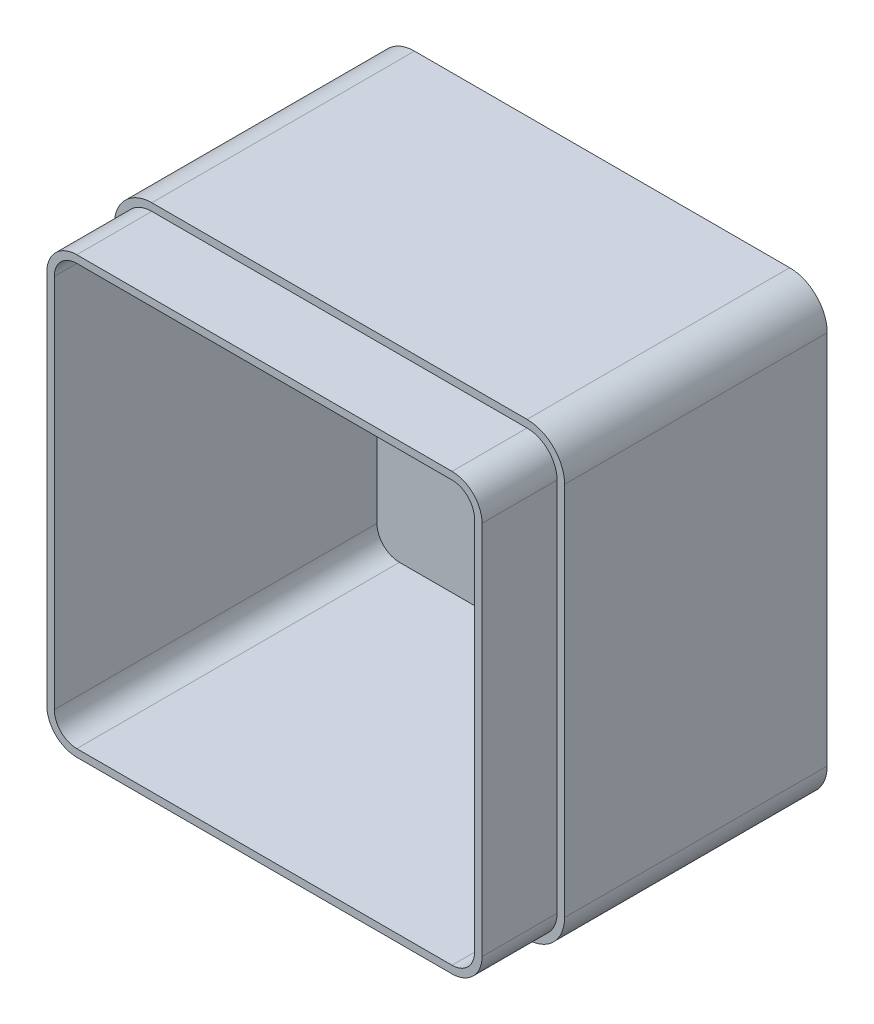
ISO-10303-21;
HEADER;
FILE_DESCRIPTION(('STEP AP214'),'2;1');
FILE_NAME('part.step','',(''),(''),'','','');
FILE_SCHEMA(('AUTOMOTIVE_DESIGN { 1 0 10303 214 1 1 1 1 }'));
ENDSEC;
DATA;
#1=APPLICATION_CONTEXT('core data for automotive mechanical design processes');
#2=APPLICATION_PROTOCOL_DEFINITION('international standard','automotive_design',2000,#1);
#3=PRODUCT_CONTEXT('',#1,'mechanical');
#4=PRODUCT('Part','Part','',(#3));
#5=PRODUCT_RELATED_PRODUCT_CATEGORY('part','',(#4));
#6=PRODUCT_DEFINITION_FORMATION('','',#4);
#7=PRODUCT_DEFINITION_CONTEXT('part definition',#1,'design');
#8=PRODUCT_DEFINITION('design','',#6,#7);
#9=PRODUCT_DEFINITION_SHAPE('','',#8);
#10=(LENGTH_UNIT() NAMED_UNIT(*) SI_UNIT(.MILLI.,.METRE.));
#11=(NAMED_UNIT(*) PLANE_ANGLE_UNIT() SI_UNIT($,.RADIAN.));
#12=(NAMED_UNIT(*) SI_UNIT($,.STERADIAN.) SOLID_ANGLE_UNIT());
#13=UNCERTAINTY_MEASURE_WITH_UNIT(LENGTH_MEASURE(1.E-05),#10,'distance_accuracy_value','');
#14=(GEOMETRIC_REPRESENTATION_CONTEXT(3) GLOBAL_UNCERTAINTY_ASSIGNED_CONTEXT((#13)) GLOBAL_UNIT_ASSIGNED_CONTEXT((#10,
#11,#12)) REPRESENTATION_CONTEXT('',''));
#15=CARTESIAN_POINT('',(0.,0.,0.));
#16=DIRECTION('',(0.,0.,1.));
#17=DIRECTION('',(1.,0.,0.));
#18=AXIS2_PLACEMENT_3D('',#15,#16,#17);
#19=CARTESIAN_POINT('',(0.,0.,90.));
#20=DIRECTION('',(0.,0.,1.));
#21=DIRECTION('',(1.,0.,0.));
#22=AXIS2_PLACEMENT_3D('',#19,#20,#21);
#23=PLANE('',#22);
#24=DIRECTION('',(0.,-1.,0.));
#25=VECTOR('',#24,1.);
#26=CARTESIAN_POINT('',(-56.,60.,90.));
#27=LINE('',#26,#25);
#28=CARTESIAN_POINT('',(-56.,50.,90.));
#29=VERTEX_POINT('',#28);
#30=CARTESIAN_POINT('',(-56.,-50.,90.));
#31=VERTEX_POINT('',#30);
#32=EDGE_CURVE('E334',#29,#31,#27,.T.);
#33=ORIENTED_EDGE('',*,*,#32,.F.);
#34=CARTESIAN_POINT('',(-50.,50.,90.));
#35=DIRECTION('',(0.,0.,1.));
#36=DIRECTION('',(1.,0.,0.));
#37=AXIS2_PLACEMENT_3D('',#34,#35,#36);
#38=CIRCLE('',#37,6.);
#39=CARTESIAN_POINT('',(-50.,56.,90.));
#40=VERTEX_POINT('',#39);
#41=EDGE_CURVE('E321',#40,#29,#38,.T.);
#42=ORIENTED_EDGE('',*,*,#41,.F.);
#43=DIRECTION('',(-1.,0.,0.));
#44=VECTOR('',#43,1.);
#45=CARTESIAN_POINT('',(-60.,56.,90.));
#46=LINE('',#45,#44);
#47=CARTESIAN_POINT('',(50.,56.,90.));
#48=VERTEX_POINT('',#47);
#49=EDGE_CURVE('E329',#48,#40,#46,.T.);
#50=ORIENTED_EDGE('',*,*,#49,.F.);
#51=CARTESIAN_POINT('',(50.,50.,90.));
#52=DIRECTION('',(0.,0.,1.));
#53=DIRECTION('',(1.,0.,0.));
#54=AXIS2_PLACEMENT_3D('',#51,#52,#53);
#55=CIRCLE('',#54,6.);
#56=CARTESIAN_POINT('',(56.,50.,90.));
#57=VERTEX_POINT('',#56);
#58=EDGE_CURVE('E330',#57,#48,#55,.T.);
#59=ORIENTED_EDGE('',*,*,#58,.F.);
#60=DIRECTION('',(0.,1.,0.));
#61=VECTOR('',#60,1.);
#62=CARTESIAN_POINT('',(56.,60.,90.));
#63=LINE('',#62,#61);
#64=CARTESIAN_POINT('',(56.,-50.,90.));
#65=VERTEX_POINT('',#64);
#66=EDGE_CURVE('E295',#65,#57,#63,.T.);
#67=ORIENTED_EDGE('',*,*,#66,.F.);
#68=CARTESIAN_POINT('',(50.,-50.,90.));
#69=DIRECTION('',(0.,0.,1.));
#70=DIRECTION('',(1.,0.,0.));
#71=AXIS2_PLACEMENT_3D('',#68,#69,#70);
#72=CIRCLE('',#71,6.);
#73=CARTESIAN_POINT('',(50.,-56.,90.));
#74=VERTEX_POINT('',#73);
#75=EDGE_CURVE('E332',#74,#65,#72,.T.);
#76=ORIENTED_EDGE('',*,*,#75,.F.);
#77=DIRECTION('',(1.,0.,0.));
#78=VECTOR('',#77,1.);
#79=CARTESIAN_POINT('',(-60.,-56.,90.));
#80=LINE('',#79,#78);
#81=CARTESIAN_POINT('',(-50.,-56.,90.));
#82=VERTEX_POINT('',#81);
#83=EDGE_CURVE('E326',#82,#74,#80,.T.);
#84=ORIENTED_EDGE('',*,*,#83,.F.);
#85=CARTESIAN_POINT('',(-50.,-50.,90.));
#86=DIRECTION('',(0.,0.,1.));
#87=DIRECTION('',(1.,0.,0.));
#88=AXIS2_PLACEMENT_3D('',#85,#86,#87);
#89=CIRCLE('',#88,6.);
#90=EDGE_CURVE('E291',#31,#82,#89,.T.);
#91=ORIENTED_EDGE('',*,*,#90,.F.);
#92=EDGE_LOOP('',(#33,#42,#50,#59,#67,#76,#84,#91));
#93=FACE_BOUND('',#92,.T.);
#94=DIRECTION('',(-1.,0.,0.));
#95=VECTOR('',#94,1.);
#96=CARTESIAN_POINT('',(50.,58.,90.));
#97=LINE('',#96,#95);
#98=CARTESIAN_POINT('',(50.,58.,90.));
#99=VERTEX_POINT('',#98);
#100=CARTESIAN_POINT('',(-50.,58.,90.));
#101=VERTEX_POINT('',#100);
#102=EDGE_CURVE('E219',#99,#101,#97,.T.);
#103=ORIENTED_EDGE('',*,*,#102,.T.);
#104=CARTESIAN_POINT('',(-50.,50.,90.));
#105=DIRECTION('',(0.,0.,1.));
#106=DIRECTION('',(1.,0.,0.));
#107=AXIS2_PLACEMENT_3D('',#104,#105,#106);
#108=CIRCLE('',#107,7.99999999999999);
#109=CARTESIAN_POINT('',(-58.,50.,90.));
#110=VERTEX_POINT('',#109);
#111=EDGE_CURVE('E239',#101,#110,#108,.T.);
#112=ORIENTED_EDGE('',*,*,#111,.T.);
#113=DIRECTION('',(0.,-1.,0.));
#114=VECTOR('',#113,1.);
#115=CARTESIAN_POINT('',(-58.,50.,90.));
#116=LINE('',#115,#114);
#117=CARTESIAN_POINT('',(-58.,-50.,90.));
#118=VERTEX_POINT('',#117);
#119=EDGE_CURVE('E199',#110,#118,#116,.T.);
#120=ORIENTED_EDGE('',*,*,#119,.T.);
#121=CARTESIAN_POINT('',(-50.,-50.,90.));
#122=DIRECTION('',(0.,0.,1.));
#123=DIRECTION('',(1.,0.,0.));
#124=AXIS2_PLACEMENT_3D('',#121,#122,#123);
#125=CIRCLE('',#124,7.99999999999999);
#126=CARTESIAN_POINT('',(-50.,-58.,90.));
#127=VERTEX_POINT('',#126);
#128=EDGE_CURVE('E48',#118,#127,#125,.T.);
#129=ORIENTED_EDGE('',*,*,#128,.T.);
#130=DIRECTION('',(1.,0.,0.));
#131=VECTOR('',#130,1.);
#132=CARTESIAN_POINT('',(-50.,-58.,90.));
#133=LINE('',#132,#131);
#134=CARTESIAN_POINT('',(50.,-58.,90.));
#135=VERTEX_POINT('',#134);
#136=EDGE_CURVE('E243',#127,#135,#133,.T.);
#137=ORIENTED_EDGE('',*,*,#136,.T.);
#138=CARTESIAN_POINT('',(50.,-50.,90.));
#139=DIRECTION('',(0.,0.,1.));
#140=DIRECTION('',(1.,0.,0.));
#141=AXIS2_PLACEMENT_3D('',#138,#139,#140);
#142=CIRCLE('',#141,7.99999999999999);
#143=CARTESIAN_POINT('',(58.,-50.,90.));
#144=VERTEX_POINT('',#143);
#145=EDGE_CURVE('E246',#135,#144,#142,.T.);
#146=ORIENTED_EDGE('',*,*,#145,.T.);
#147=DIRECTION('',(0.,1.,0.));
#148=VECTOR('',#147,1.);
#149=CARTESIAN_POINT('',(58.,-50.,90.));
#150=LINE('',#149,#148);
#151=CARTESIAN_POINT('',(58.,50.,90.));
#152=VERTEX_POINT('',#151);
#153=EDGE_CURVE('E249',#144,#152,#150,.T.);
#154=ORIENTED_EDGE('',*,*,#153,.T.);
#155=CARTESIAN_POINT('',(50.,50.,90.));
#156=DIRECTION('',(0.,0.,1.));
#157=DIRECTION('',(1.,0.,0.));
#158=AXIS2_PLACEMENT_3D('',#155,#156,#157);
#159=CIRCLE('',#158,7.99999999999999);
#160=EDGE_CURVE('E222',#152,#99,#159,.T.);
#161=ORIENTED_EDGE('',*,*,#160,.T.);
#162=EDGE_LOOP('',(#103,#112,#120,#129,#137,#146,#154,#161));
#163=FACE_BOUND('',#162,.T.);
#164=ADVANCED_FACE('F33',(#93,#163),#23,.T.);
#165=CARTESIAN_POINT('',(56.,60.,90.));
#166=DIRECTION('',(-1.,0.,0.));
#167=DIRECTION('',(0.,-1.,0.));
#168=AXIS2_PLACEMENT_3D('',#165,#166,#167);
#169=PLANE('',#168);
#170=ORIENTED_EDGE('',*,*,#66,.T.);
#171=DIRECTION('',(0.,0.,1.));
#172=VECTOR('',#171,1.);
#173=CARTESIAN_POINT('',(56.,50.,90.));
#174=LINE('',#173,#172);
#175=CARTESIAN_POINT('',(56.,50.,4.));
#176=VERTEX_POINT('',#175);
#177=EDGE_CURVE('E286',#176,#57,#174,.T.);
#178=ORIENTED_EDGE('',*,*,#177,.F.);
#179=DIRECTION('',(0.,1.,0.));
#180=VECTOR('',#179,1.);
#181=CARTESIAN_POINT('',(56.,60.,4.));
#182=LINE('',#181,#180);
#183=CARTESIAN_POINT('',(56.,-50.,4.));
#184=VERTEX_POINT('',#183);
#185=EDGE_CURVE('E281',#184,#176,#182,.T.);
#186=ORIENTED_EDGE('',*,*,#185,.F.);
#187=DIRECTION('',(0.,0.,1.));
#188=VECTOR('',#187,1.);
#189=CARTESIAN_POINT('',(56.,-50.,90.));
#190=LINE('',#189,#188);
#191=EDGE_CURVE('E282',#65,#184,#190,.F.);
#192=ORIENTED_EDGE('',*,*,#191,.F.);
#193=EDGE_LOOP('',(#170,#178,#186,#192));
#194=FACE_BOUND('',#193,.T.);
#195=ADVANCED_FACE('F427',(#194),#169,.T.);
#196=CARTESIAN_POINT('',(-60.,56.,90.));
#197=DIRECTION('',(0.,-1.,0.));
#198=DIRECTION('',(0.,0.,-1.));
#199=AXIS2_PLACEMENT_3D('',#196,#197,#198);
#200=PLANE('',#199);
#201=ORIENTED_EDGE('',*,*,#49,.T.);
#202=DIRECTION('',(0.,0.,-1.));
#203=VECTOR('',#202,1.);
#204=CARTESIAN_POINT('',(-50.,56.,90.));
#205=LINE('',#204,#203);
#206=CARTESIAN_POINT('',(-50.,56.,4.));
#207=VERTEX_POINT('',#206);
#208=EDGE_CURVE('E285',#207,#40,#205,.F.);
#209=ORIENTED_EDGE('',*,*,#208,.F.);
#210=DIRECTION('',(-1.,0.,0.));
#211=VECTOR('',#210,1.);
#212=CARTESIAN_POINT('',(-60.,56.,4.));
#213=LINE('',#212,#211);
#214=CARTESIAN_POINT('',(50.,56.,4.));
#215=VERTEX_POINT('',#214);
#216=EDGE_CURVE('E289',#215,#207,#213,.T.);
#217=ORIENTED_EDGE('',*,*,#216,.F.);
#218=DIRECTION('',(0.,0.,-1.));
#219=VECTOR('',#218,1.);
#220=CARTESIAN_POINT('',(50.,56.,90.));
#221=LINE('',#220,#219);
#222=EDGE_CURVE('E311',#48,#215,#221,.T.);
#223=ORIENTED_EDGE('',*,*,#222,.F.);
#224=EDGE_LOOP('',(#201,#209,#217,#223));
#225=FACE_BOUND('',#224,.T.);
#226=ADVANCED_FACE('F432',(#225),#200,.T.);
#227=CARTESIAN_POINT('',(-56.,60.,90.));
#228=DIRECTION('',(1.,0.,0.));
#229=DIRECTION('',(0.,1.,0.));
#230=AXIS2_PLACEMENT_3D('',#227,#228,#229);
#231=PLANE('',#230);
#232=DIRECTION('',(0.,-1.,0.));
#233=VECTOR('',#232,1.);
#234=CARTESIAN_POINT('',(-56.,60.,4.));
#235=LINE('',#234,#233);
#236=CARTESIAN_POINT('',(-56.,50.,4.));
#237=VERTEX_POINT('',#236);
#238=CARTESIAN_POINT('',(-56.,-50.,4.));
#239=VERTEX_POINT('',#238);
#240=EDGE_CURVE('E296',#237,#239,#235,.T.);
#241=ORIENTED_EDGE('',*,*,#240,.F.);
#242=DIRECTION('',(0.,0.,1.));
#243=VECTOR('',#242,1.);
#244=CARTESIAN_POINT('',(-56.,50.,90.));
#245=LINE('',#244,#243);
#246=EDGE_CURVE('E299',#29,#237,#245,.F.);
#247=ORIENTED_EDGE('',*,*,#246,.F.);
#248=ORIENTED_EDGE('',*,*,#32,.T.);
#249=DIRECTION('',(0.,0.,1.));
#250=VECTOR('',#249,1.);
#251=CARTESIAN_POINT('',(-56.,-50.,90.));
#252=LINE('',#251,#250);
#253=EDGE_CURVE('E319',#239,#31,#252,.T.);
#254=ORIENTED_EDGE('',*,*,#253,.F.);
#255=EDGE_LOOP('',(#241,#247,#248,#254));
#256=FACE_BOUND('',#255,.T.);
#257=ADVANCED_FACE('F461',(#256),#231,.T.);
#258=CARTESIAN_POINT('',(-60.,-56.,90.));
#259=DIRECTION('',(0.,1.,0.));
#260=DIRECTION('',(0.,0.,1.));
#261=AXIS2_PLACEMENT_3D('',#258,#259,#260);
#262=PLANE('',#261);
#263=ORIENTED_EDGE('',*,*,#83,.T.);
#264=DIRECTION('',(0.,0.,1.));
#265=VECTOR('',#264,1.);
#266=CARTESIAN_POINT('',(50.,-56.,90.));
#267=LINE('',#266,#265);
#268=CARTESIAN_POINT('',(50.,-56.,4.));
#269=VERTEX_POINT('',#268);
#270=EDGE_CURVE('E324',#269,#74,#267,.T.);
#271=ORIENTED_EDGE('',*,*,#270,.F.);
#272=DIRECTION('',(1.,0.,0.));
#273=VECTOR('',#272,1.);
#274=CARTESIAN_POINT('',(-60.,-56.,4.));
#275=LINE('',#274,#273);
#276=CARTESIAN_POINT('',(-50.,-56.,4.));
#277=VERTEX_POINT('',#276);
#278=EDGE_CURVE('E292',#277,#269,#275,.T.);
#279=ORIENTED_EDGE('',*,*,#278,.F.);
#280=DIRECTION('',(0.,0.,1.));
#281=VECTOR('',#280,1.);
#282=CARTESIAN_POINT('',(-50.,-56.,90.));
#283=LINE('',#282,#281);
#284=EDGE_CURVE('E306',#82,#277,#283,.F.);
#285=ORIENTED_EDGE('',*,*,#284,.F.);
#286=EDGE_LOOP('',(#263,#271,#279,#285));
#287=FACE_BOUND('',#286,.T.);
#288=ADVANCED_FACE('F457',(#287),#262,.T.);
#289=CARTESIAN_POINT('',(0.,0.,4.));
#290=DIRECTION('',(0.,0.,1.));
#291=DIRECTION('',(1.,0.,0.));
#292=AXIS2_PLACEMENT_3D('',#289,#290,#291);
#293=PLANE('',#292);
#294=ORIENTED_EDGE('',*,*,#278,.T.);
#295=CARTESIAN_POINT('',(50.,-50.,4.));
#296=DIRECTION('',(0.,0.,1.));
#297=DIRECTION('',(1.,0.,0.));
#298=AXIS2_PLACEMENT_3D('',#295,#296,#297);
#299=CIRCLE('',#298,6.);
#300=EDGE_CURVE('E300',#184,#269,#299,.F.);
#301=ORIENTED_EDGE('',*,*,#300,.F.);
#302=ORIENTED_EDGE('',*,*,#185,.T.);
#303=CARTESIAN_POINT('',(50.,50.,4.));
#304=DIRECTION('',(0.,0.,1.));
#305=DIRECTION('',(1.,0.,0.));
#306=AXIS2_PLACEMENT_3D('',#303,#304,#305);
#307=CIRCLE('',#306,6.);
#308=EDGE_CURVE('E305',#215,#176,#307,.F.);
#309=ORIENTED_EDGE('',*,*,#308,.F.);
#310=ORIENTED_EDGE('',*,*,#216,.T.);
#311=CARTESIAN_POINT('',(-50.,50.,4.));
#312=DIRECTION('',(0.,0.,1.));
#313=DIRECTION('',(1.,0.,0.));
#314=AXIS2_PLACEMENT_3D('',#311,#312,#313);
#315=CIRCLE('',#314,6.);
#316=EDGE_CURVE('E303',#237,#207,#315,.F.);
#317=ORIENTED_EDGE('',*,*,#316,.F.);
#318=ORIENTED_EDGE('',*,*,#240,.T.);
#319=CARTESIAN_POINT('',(-50.,-50.,4.));
#320=DIRECTION('',(0.,0.,1.));
#321=DIRECTION('',(1.,0.,0.));
#322=AXIS2_PLACEMENT_3D('',#319,#320,#321);
#323=CIRCLE('',#322,6.);
#324=EDGE_CURVE('E297',#277,#239,#323,.F.);
#325=ORIENTED_EDGE('',*,*,#324,.F.);
#326=EDGE_LOOP('',(#294,#301,#302,#309,#310,#317,#318,#325));
#327=FACE_BOUND('',#326,.T.);
#328=ADVANCED_FACE('F453',(#327),#293,.T.);
#329=CARTESIAN_POINT('',(-50.,-50.,90.));
#330=DIRECTION('',(0.,0.,-1.));
#331=DIRECTION('',(-1.,0.,0.));
#332=AXIS2_PLACEMENT_3D('',#329,#330,#331);
#333=CYLINDRICAL_SURFACE('',#332,6.);
#334=ORIENTED_EDGE('',*,*,#90,.T.);
#335=ORIENTED_EDGE('',*,*,#284,.T.);
#336=ORIENTED_EDGE('',*,*,#324,.T.);
#337=ORIENTED_EDGE('',*,*,#253,.T.);
#338=EDGE_LOOP('',(#334,#335,#336,#337));
#339=FACE_BOUND('',#338,.T.);
#340=ADVANCED_FACE('F449',(#339),#333,.F.);
#341=CARTESIAN_POINT('',(50.,-50.,90.));
#342=DIRECTION('',(0.,0.,-1.));
#343=DIRECTION('',(-1.,0.,0.));
#344=AXIS2_PLACEMENT_3D('',#341,#342,#343);
#345=CYLINDRICAL_SURFACE('',#344,6.);
#346=ORIENTED_EDGE('',*,*,#75,.T.);
#347=ORIENTED_EDGE('',*,*,#191,.T.);
#348=ORIENTED_EDGE('',*,*,#300,.T.);
#349=ORIENTED_EDGE('',*,*,#270,.T.);
#350=EDGE_LOOP('',(#346,#347,#348,#349));
#351=FACE_BOUND('',#350,.T.);
#352=ADVANCED_FACE('F445',(#351),#345,.F.);
#353=CARTESIAN_POINT('',(50.,50.,90.));
#354=DIRECTION('',(0.,0.,-1.));
#355=DIRECTION('',(-1.,0.,0.));
#356=AXIS2_PLACEMENT_3D('',#353,#354,#355);
#357=CYLINDRICAL_SURFACE('',#356,6.);
#358=ORIENTED_EDGE('',*,*,#58,.T.);
#359=ORIENTED_EDGE('',*,*,#222,.T.);
#360=ORIENTED_EDGE('',*,*,#308,.T.);
#361=ORIENTED_EDGE('',*,*,#177,.T.);
#362=EDGE_LOOP('',(#358,#359,#360,#361));
#363=FACE_BOUND('',#362,.T.);
#364=ADVANCED_FACE('F441',(#363),#357,.F.);
#365=CARTESIAN_POINT('',(-50.,50.,90.));
#366=DIRECTION('',(0.,0.,-1.));
#367=DIRECTION('',(-1.,0.,0.));
#368=AXIS2_PLACEMENT_3D('',#365,#366,#367);
#369=CYLINDRICAL_SURFACE('',#368,6.);
#370=ORIENTED_EDGE('',*,*,#41,.T.);
#371=ORIENTED_EDGE('',*,*,#246,.T.);
#372=ORIENTED_EDGE('',*,*,#316,.T.);
#373=ORIENTED_EDGE('',*,*,#208,.T.);
#374=EDGE_LOOP('',(#370,#371,#372,#373));
#375=FACE_BOUND('',#374,.T.);
#376=ADVANCED_FACE('F438',(#375),#369,.F.);
#377=CARTESIAN_POINT('',(50.,50.,70.));
#378=DIRECTION('',(0.,0.,1.));
#379=DIRECTION('',(1.,0.,0.));
#380=AXIS2_PLACEMENT_3D('',#377,#378,#379);
#381=PLANE('',#380);
#382=DIRECTION('',(-1.,0.,0.));
#383=VECTOR('',#382,1.);
#384=CARTESIAN_POINT('',(50.,58.,70.));
#385=LINE('',#384,#383);
#386=CARTESIAN_POINT('',(50.,58.,70.));
#387=VERTEX_POINT('',#386);
#388=CARTESIAN_POINT('',(-50.,58.,70.));
#389=VERTEX_POINT('',#388);
#390=EDGE_CURVE('E205',#387,#389,#385,.T.);
#391=ORIENTED_EDGE('',*,*,#390,.F.);
#392=CARTESIAN_POINT('',(50.,50.,70.));
#393=DIRECTION('',(0.,0.,1.));
#394=DIRECTION('',(1.,0.,0.));
#395=AXIS2_PLACEMENT_3D('',#392,#393,#394);
#396=CIRCLE('',#395,7.99999999999999);
#397=CARTESIAN_POINT('',(58.,50.,70.));
#398=VERTEX_POINT('',#397);
#399=EDGE_CURVE('E235',#398,#387,#396,.T.);
#400=ORIENTED_EDGE('',*,*,#399,.F.);
#401=DIRECTION('',(0.,1.,0.));
#402=VECTOR('',#401,1.);
#403=CARTESIAN_POINT('',(58.,-50.,70.));
#404=LINE('',#403,#402);
#405=CARTESIAN_POINT('',(58.,-50.,70.));
#406=VERTEX_POINT('',#405);
#407=EDGE_CURVE('E232',#406,#398,#404,.T.);
#408=ORIENTED_EDGE('',*,*,#407,.F.);
#409=CARTESIAN_POINT('',(50.,-50.,70.));
#410=DIRECTION('',(0.,0.,1.));
#411=DIRECTION('',(1.,0.,0.));
#412=AXIS2_PLACEMENT_3D('',#409,#410,#411);
#413=CIRCLE('',#412,7.99999999999999);
#414=CARTESIAN_POINT('',(50.,-58.,70.));
#415=VERTEX_POINT('',#414);
#416=EDGE_CURVE('E229',#415,#406,#413,.T.);
#417=ORIENTED_EDGE('',*,*,#416,.F.);
#418=DIRECTION('',(1.,0.,0.));
#419=VECTOR('',#418,1.);
#420=CARTESIAN_POINT('',(-50.,-58.,70.));
#421=LINE('',#420,#419);
#422=CARTESIAN_POINT('',(-50.,-58.,70.));
#423=VERTEX_POINT('',#422);
#424=EDGE_CURVE('E226',#423,#415,#421,.T.);
#425=ORIENTED_EDGE('',*,*,#424,.F.);
#426=CARTESIAN_POINT('',(-50.,-50.,70.));
#427=DIRECTION('',(0.,0.,1.));
#428=DIRECTION('',(1.,0.,0.));
#429=AXIS2_PLACEMENT_3D('',#426,#427,#428);
#430=CIRCLE('',#429,7.99999999999999);
#431=CARTESIAN_POINT('',(-58.,-50.,70.));
#432=VERTEX_POINT('',#431);
#433=EDGE_CURVE('E215',#432,#423,#430,.T.);
#434=ORIENTED_EDGE('',*,*,#433,.F.);
#435=DIRECTION('',(0.,-1.,0.));
#436=VECTOR('',#435,1.);
#437=CARTESIAN_POINT('',(-58.,50.,70.));
#438=LINE('',#437,#436);
#439=CARTESIAN_POINT('',(-58.,50.,70.));
#440=VERTEX_POINT('',#439);
#441=EDGE_CURVE('E197',#440,#432,#438,.T.);
#442=ORIENTED_EDGE('',*,*,#441,.F.);
#443=CARTESIAN_POINT('',(-50.,50.,70.));
#444=DIRECTION('',(0.,0.,1.));
#445=DIRECTION('',(1.,0.,0.));
#446=AXIS2_PLACEMENT_3D('',#443,#444,#445);
#447=CIRCLE('',#446,7.99999999999999);
#448=EDGE_CURVE('E211',#389,#440,#447,.T.);
#449=ORIENTED_EDGE('',*,*,#448,.F.);
#450=EDGE_LOOP('',(#391,#400,#408,#417,#425,#434,#442,#449));
#451=FACE_BOUND('',#450,.T.);
#452=CARTESIAN_POINT('',(50.,50.,70.));
#453=DIRECTION('',(0.,0.,1.));
#454=DIRECTION('',(1.,0.,0.));
#455=AXIS2_PLACEMENT_3D('',#452,#453,#454);
#456=CIRCLE('',#455,9.99999999999999);
#457=CARTESIAN_POINT('',(60.,50.,70.));
#458=VERTEX_POINT('',#457);
#459=CARTESIAN_POINT('',(50.,60.,70.));
#460=VERTEX_POINT('',#459);
#461=EDGE_CURVE('E255',#458,#460,#456,.T.);
#462=ORIENTED_EDGE('',*,*,#461,.T.);
#463=DIRECTION('',(-1.,0.,0.));
#464=VECTOR('',#463,1.);
#465=CARTESIAN_POINT('',(50.,60.,70.));
#466=LINE('',#465,#464);
#467=CARTESIAN_POINT('',(-50.,60.,70.));
#468=VERTEX_POINT('',#467);
#469=EDGE_CURVE('E56',#460,#468,#466,.T.);
#470=ORIENTED_EDGE('',*,*,#469,.T.);
#471=CARTESIAN_POINT('',(-50.,50.,70.));
#472=DIRECTION('',(0.,0.,1.));
#473=DIRECTION('',(1.,0.,0.));
#474=AXIS2_PLACEMENT_3D('',#471,#472,#473);
#475=CIRCLE('',#474,9.99999999999999);
#476=CARTESIAN_POINT('',(-60.,50.,70.));
#477=VERTEX_POINT('',#476);
#478=EDGE_CURVE('E269',#468,#477,#475,.T.);
#479=ORIENTED_EDGE('',*,*,#478,.T.);
#480=DIRECTION('',(0.,-1.,0.));
#481=VECTOR('',#480,1.);
#482=CARTESIAN_POINT('',(-60.,50.,70.));
#483=LINE('',#482,#481);
#484=CARTESIAN_POINT('',(-60.,-50.,70.));
#485=VERTEX_POINT('',#484);
#486=EDGE_CURVE('E271',#477,#485,#483,.T.);
#487=ORIENTED_EDGE('',*,*,#486,.T.);
#488=CARTESIAN_POINT('',(-50.,-50.,70.));
#489=DIRECTION('',(0.,0.,1.));
#490=DIRECTION('',(1.,0.,0.));
#491=AXIS2_PLACEMENT_3D('',#488,#489,#490);
#492=CIRCLE('',#491,9.99999999999999);
#493=CARTESIAN_POINT('',(-50.,-60.,70.));
#494=VERTEX_POINT('',#493);
#495=EDGE_CURVE('E273',#485,#494,#492,.T.);
#496=ORIENTED_EDGE('',*,*,#495,.T.);
#497=DIRECTION('',(1.,0.,0.));
#498=VECTOR('',#497,1.);
#499=CARTESIAN_POINT('',(-50.,-60.,70.));
#500=LINE('',#499,#498);
#501=CARTESIAN_POINT('',(50.,-60.,70.));
#502=VERTEX_POINT('',#501);
#503=EDGE_CURVE('E275',#494,#502,#500,.T.);
#504=ORIENTED_EDGE('',*,*,#503,.T.);
#505=CARTESIAN_POINT('',(50.,-50.,70.));
#506=DIRECTION('',(0.,0.,1.));
#507=DIRECTION('',(1.,0.,0.));
#508=AXIS2_PLACEMENT_3D('',#505,#506,#507);
#509=CIRCLE('',#508,9.99999999999999);
#510=CARTESIAN_POINT('',(60.,-50.,70.));
#511=VERTEX_POINT('',#510);
#512=EDGE_CURVE('E277',#502,#511,#509,.T.);
#513=ORIENTED_EDGE('',*,*,#512,.T.);
#514=DIRECTION('',(0.,1.,0.));
#515=VECTOR('',#514,1.);
#516=CARTESIAN_POINT('',(60.,-50.,70.));
#517=LINE('',#516,#515);
#518=EDGE_CURVE('E279',#511,#458,#517,.T.);
#519=ORIENTED_EDGE('',*,*,#518,.T.);
#520=EDGE_LOOP('',(#462,#470,#479,#487,#496,#504,#513,#519));
#521=FACE_BOUND('',#520,.T.);
#522=ADVANCED_FACE('F210',(#451,#521),#381,.T.);
#523=CARTESIAN_POINT('',(-50.,50.,70.));
#524=DIRECTION('',(0.,0.,1.));
#525=DIRECTION('',(1.,0.,0.));
#526=AXIS2_PLACEMENT_3D('',#523,#524,#525);
#527=CYLINDRICAL_SURFACE('',#526,7.99999999999999);
#528=ORIENTED_EDGE('',*,*,#111,.F.);
#529=DIRECTION('',(0.,0.,1.));
#530=VECTOR('',#529,1.);
#531=CARTESIAN_POINT('',(-50.,58.,70.));
#532=LINE('',#531,#530);
#533=EDGE_CURVE('E218',#389,#101,#532,.T.);
#534=ORIENTED_EDGE('',*,*,#533,.F.);
#535=ORIENTED_EDGE('',*,*,#448,.T.);
#536=DIRECTION('',(0.,0.,1.));
#537=VECTOR('',#536,1.);
#538=CARTESIAN_POINT('',(-58.,50.,70.));
#539=LINE('',#538,#537);
#540=EDGE_CURVE('E194',#440,#110,#539,.T.);
#541=ORIENTED_EDGE('',*,*,#540,.T.);
#542=EDGE_LOOP('',(#528,#534,#535,#541));
#543=FACE_BOUND('',#542,.T.);
#544=ADVANCED_FACE('F217',(#543),#527,.T.);
#545=CARTESIAN_POINT('',(50.,58.,70.));
#546=DIRECTION('',(0.,1.,0.));
#547=DIRECTION('',(0.,0.,1.));
#548=AXIS2_PLACEMENT_3D('',#545,#546,#547);
#549=PLANE('',#548);
#550=ORIENTED_EDGE('',*,*,#102,.F.);
#551=DIRECTION('',(0.,0.,1.));
#552=VECTOR('',#551,1.);
#553=CARTESIAN_POINT('',(50.,58.,70.));
#554=LINE('',#553,#552);
#555=EDGE_CURVE('E256',#387,#99,#554,.T.);
#556=ORIENTED_EDGE('',*,*,#555,.F.);
#557=ORIENTED_EDGE('',*,*,#390,.T.);
#558=ORIENTED_EDGE('',*,*,#533,.T.);
#559=EDGE_LOOP('',(#550,#556,#557,#558));
#560=FACE_BOUND('',#559,.T.);
#561=ADVANCED_FACE('F472',(#560),#549,.T.);
#562=CARTESIAN_POINT('',(50.,50.,70.));
#563=DIRECTION('',(0.,0.,1.));
#564=DIRECTION('',(1.,0.,0.));
#565=AXIS2_PLACEMENT_3D('',#562,#563,#564);
#566=CYLINDRICAL_SURFACE('',#565,7.99999999999999);
#567=ORIENTED_EDGE('',*,*,#160,.F.);
#568=DIRECTION('',(0.,0.,1.));
#569=VECTOR('',#568,1.);
#570=CARTESIAN_POINT('',(58.,50.,70.));
#571=LINE('',#570,#569);
#572=EDGE_CURVE('E258',#398,#152,#571,.T.);
#573=ORIENTED_EDGE('',*,*,#572,.F.);
#574=ORIENTED_EDGE('',*,*,#399,.T.);
#575=ORIENTED_EDGE('',*,*,#555,.T.);
#576=EDGE_LOOP('',(#567,#573,#574,#575));
#577=FACE_BOUND('',#576,.T.);
#578=ADVANCED_FACE('F487',(#577),#566,.T.);
#579=CARTESIAN_POINT('',(58.,-50.,70.));
#580=DIRECTION('',(1.,0.,0.));
#581=DIRECTION('',(0.,1.,0.));
#582=AXIS2_PLACEMENT_3D('',#579,#580,#581);
#583=PLANE('',#582);
#584=ORIENTED_EDGE('',*,*,#153,.F.);
#585=DIRECTION('',(0.,0.,1.));
#586=VECTOR('',#585,1.);
#587=CARTESIAN_POINT('',(58.,-50.,70.));
#588=LINE('',#587,#586);
#589=EDGE_CURVE('E260',#406,#144,#588,.T.);
#590=ORIENTED_EDGE('',*,*,#589,.F.);
#591=ORIENTED_EDGE('',*,*,#407,.T.);
#592=ORIENTED_EDGE('',*,*,#572,.T.);
#593=EDGE_LOOP('',(#584,#590,#591,#592));
#594=FACE_BOUND('',#593,.T.);
#595=ADVANCED_FACE('F483',(#594),#583,.T.);
#596=CARTESIAN_POINT('',(50.,-50.,70.));
#597=DIRECTION('',(0.,0.,1.));
#598=DIRECTION('',(1.,0.,0.));
#599=AXIS2_PLACEMENT_3D('',#596,#597,#598);
#600=CYLINDRICAL_SURFACE('',#599,7.99999999999999);
#601=ORIENTED_EDGE('',*,*,#145,.F.);
#602=DIRECTION('',(0.,0.,1.));
#603=VECTOR('',#602,1.);
#604=CARTESIAN_POINT('',(50.,-58.,70.));
#605=LINE('',#604,#603);
#606=EDGE_CURVE('E262',#415,#135,#605,.T.);
#607=ORIENTED_EDGE('',*,*,#606,.F.);
#608=ORIENTED_EDGE('',*,*,#416,.T.);
#609=ORIENTED_EDGE('',*,*,#589,.T.);
#610=EDGE_LOOP('',(#601,#607,#608,#609));
#611=FACE_BOUND('',#610,.T.);
#612=ADVANCED_FACE('F479',(#611),#600,.T.);
#613=CARTESIAN_POINT('',(-50.,-58.,70.));
#614=DIRECTION('',(0.,-1.,0.));
#615=DIRECTION('',(0.,0.,-1.));
#616=AXIS2_PLACEMENT_3D('',#613,#614,#615);
#617=PLANE('',#616);
#618=ORIENTED_EDGE('',*,*,#136,.F.);
#619=DIRECTION('',(0.,0.,1.));
#620=VECTOR('',#619,1.);
#621=CARTESIAN_POINT('',(-50.,-58.,70.));
#622=LINE('',#621,#620);
#623=EDGE_CURVE('E264',#423,#127,#622,.T.);
#624=ORIENTED_EDGE('',*,*,#623,.F.);
#625=ORIENTED_EDGE('',*,*,#424,.T.);
#626=ORIENTED_EDGE('',*,*,#606,.T.);
#627=EDGE_LOOP('',(#618,#624,#625,#626));
#628=FACE_BOUND('',#627,.T.);
#629=ADVANCED_FACE('F476',(#628),#617,.T.);
#630=CARTESIAN_POINT('',(-50.,-50.,70.));
#631=DIRECTION('',(0.,0.,1.));
#632=DIRECTION('',(1.,0.,0.));
#633=AXIS2_PLACEMENT_3D('',#630,#631,#632);
#634=CYLINDRICAL_SURFACE('',#633,7.99999999999999);
#635=ORIENTED_EDGE('',*,*,#128,.F.);
#636=DIRECTION('',(0.,0.,1.));
#637=VECTOR('',#636,1.);
#638=CARTESIAN_POINT('',(-58.,-50.,70.));
#639=LINE('',#638,#637);
#640=EDGE_CURVE('E204',#432,#118,#639,.T.);
#641=ORIENTED_EDGE('',*,*,#640,.F.);
#642=ORIENTED_EDGE('',*,*,#433,.T.);
#643=ORIENTED_EDGE('',*,*,#623,.T.);
#644=EDGE_LOOP('',(#635,#641,#642,#643));
#645=FACE_BOUND('',#644,.T.);
#646=ADVANCED_FACE('F422',(#645),#634,.T.);
#647=CARTESIAN_POINT('',(-58.,50.,70.));
#648=DIRECTION('',(-1.,0.,0.));
#649=DIRECTION('',(0.,-1.,0.));
#650=AXIS2_PLACEMENT_3D('',#647,#648,#649);
#651=PLANE('',#650);
#652=ORIENTED_EDGE('',*,*,#119,.F.);
#653=ORIENTED_EDGE('',*,*,#540,.F.);
#654=ORIENTED_EDGE('',*,*,#441,.T.);
#655=ORIENTED_EDGE('',*,*,#640,.T.);
#656=EDGE_LOOP('',(#652,#653,#654,#655));
#657=FACE_BOUND('',#656,.T.);
#658=ADVANCED_FACE('F196',(#657),#651,.T.);
#659=CARTESIAN_POINT('',(0.,0.,0.));
#660=DIRECTION('',(0.,0.,1.));
#661=DIRECTION('',(1.,0.,0.));
#662=AXIS2_PLACEMENT_3D('',#659,#660,#661);
#663=PLANE('',#662);
#664=DIRECTION('',(1.,0.,0.));
#665=VECTOR('',#664,1.);
#666=CARTESIAN_POINT('',(-60.,-60.,0.));
#667=LINE('',#666,#665);
#668=CARTESIAN_POINT('',(-50.,-60.,0.));
#669=VERTEX_POINT('',#668);
#670=CARTESIAN_POINT('',(50.,-60.,0.));
#671=VERTEX_POINT('',#670);
#672=EDGE_CURVE('E350',#669,#671,#667,.T.);
#673=ORIENTED_EDGE('',*,*,#672,.F.);
#674=CARTESIAN_POINT('',(-50.,-50.,0.));
#675=DIRECTION('',(0.,0.,1.));
#676=DIRECTION('',(1.,0.,0.));
#677=AXIS2_PLACEMENT_3D('',#674,#675,#676);
#678=CIRCLE('',#677,10.);
#679=CARTESIAN_POINT('',(-60.,-50.,0.));
#680=VERTEX_POINT('',#679);
#681=EDGE_CURVE('E364',#669,#680,#678,.F.);
#682=ORIENTED_EDGE('',*,*,#681,.T.);
#683=DIRECTION('',(0.,-1.,0.));
#684=VECTOR('',#683,1.);
#685=CARTESIAN_POINT('',(-60.,60.,0.));
#686=LINE('',#685,#684);
#687=CARTESIAN_POINT('',(-60.,50.,0.));
#688=VERTEX_POINT('',#687);
#689=EDGE_CURVE('E347',#688,#680,#686,.T.);
#690=ORIENTED_EDGE('',*,*,#689,.F.);
#691=CARTESIAN_POINT('',(-50.,50.,0.));
#692=DIRECTION('',(0.,0.,1.));
#693=DIRECTION('',(1.,0.,0.));
#694=AXIS2_PLACEMENT_3D('',#691,#692,#693);
#695=CIRCLE('',#694,10.);
#696=CARTESIAN_POINT('',(-50.,60.,0.));
#697=VERTEX_POINT('',#696);
#698=EDGE_CURVE('E358',#688,#697,#695,.F.);
#699=ORIENTED_EDGE('',*,*,#698,.T.);
#700=DIRECTION('',(-1.,0.,0.));
#701=VECTOR('',#700,1.);
#702=CARTESIAN_POINT('',(-60.,60.,0.));
#703=LINE('',#702,#701);
#704=CARTESIAN_POINT('',(50.,60.,0.));
#705=VERTEX_POINT('',#704);
#706=EDGE_CURVE('E344',#705,#697,#703,.T.);
#707=ORIENTED_EDGE('',*,*,#706,.F.);
#708=CARTESIAN_POINT('',(50.,50.,0.));
#709=DIRECTION('',(0.,0.,1.));
#710=DIRECTION('',(1.,0.,0.));
#711=AXIS2_PLACEMENT_3D('',#708,#709,#710);
#712=CIRCLE('',#711,10.);
#713=CARTESIAN_POINT('',(60.,50.,0.));
#714=VERTEX_POINT('',#713);
#715=EDGE_CURVE('E360',#705,#714,#712,.F.);
#716=ORIENTED_EDGE('',*,*,#715,.T.);
#717=DIRECTION('',(0.,1.,0.));
#718=VECTOR('',#717,1.);
#719=CARTESIAN_POINT('',(60.,60.,0.));
#720=LINE('',#719,#718);
#721=CARTESIAN_POINT('',(60.,-50.,0.));
#722=VERTEX_POINT('',#721);
#723=EDGE_CURVE('E314',#722,#714,#720,.T.);
#724=ORIENTED_EDGE('',*,*,#723,.F.);
#725=CARTESIAN_POINT('',(50.,-50.,0.));
#726=DIRECTION('',(0.,0.,1.));
#727=DIRECTION('',(1.,0.,0.));
#728=AXIS2_PLACEMENT_3D('',#725,#726,#727);
#729=CIRCLE('',#728,10.);
#730=EDGE_CURVE('E362',#722,#671,#729,.F.);
#731=ORIENTED_EDGE('',*,*,#730,.T.);
#732=EDGE_LOOP('',(#673,#682,#690,#699,#707,#716,#724,#731));
#733=FACE_BOUND('',#732,.T.);
#734=ADVANCED_FACE('F414',(#733),#663,.F.);
#735=CARTESIAN_POINT('',(50.,-50.,90.));
#736=DIRECTION('',(0.,0.,-1.));
#737=DIRECTION('',(-1.,0.,0.));
#738=AXIS2_PLACEMENT_3D('',#735,#736,#737);
#739=CYLINDRICAL_SURFACE('',#738,10.);
#740=DIRECTION('',(0.,0.,-1.));
#741=VECTOR('',#740,1.);
#742=CARTESIAN_POINT('',(60.,-50.,90.));
#743=LINE('',#742,#741);
#744=EDGE_CURVE('E374',#511,#722,#743,.T.);
#745=ORIENTED_EDGE('',*,*,#744,.F.);
#746=ORIENTED_EDGE('',*,*,#512,.F.);
#747=DIRECTION('',(0.,0.,-1.));
#748=VECTOR('',#747,1.);
#749=CARTESIAN_POINT('',(50.,-60.,90.));
#750=LINE('',#749,#748);
#751=EDGE_CURVE('E353',#671,#502,#750,.F.);
#752=ORIENTED_EDGE('',*,*,#751,.F.);
#753=ORIENTED_EDGE('',*,*,#730,.F.);
#754=EDGE_LOOP('',(#745,#746,#752,#753));
#755=FACE_BOUND('',#754,.T.);
#756=ADVANCED_FACE('F403',(#755),#739,.T.);
#757=CARTESIAN_POINT('',(-50.,-50.,90.));
#758=DIRECTION('',(0.,0.,-1.));
#759=DIRECTION('',(-1.,0.,0.));
#760=AXIS2_PLACEMENT_3D('',#757,#758,#759);
#761=CYLINDRICAL_SURFACE('',#760,10.);
#762=DIRECTION('',(0.,0.,-1.));
#763=VECTOR('',#762,1.);
#764=CARTESIAN_POINT('',(-50.,-60.,90.));
#765=LINE('',#764,#763);
#766=EDGE_CURVE('E356',#494,#669,#765,.T.);
#767=ORIENTED_EDGE('',*,*,#766,.F.);
#768=ORIENTED_EDGE('',*,*,#495,.F.);
#769=DIRECTION('',(0.,0.,-1.));
#770=VECTOR('',#769,1.);
#771=CARTESIAN_POINT('',(-60.,-50.,90.));
#772=LINE('',#771,#770);
#773=EDGE_CURVE('E368',#680,#485,#772,.F.);
#774=ORIENTED_EDGE('',*,*,#773,.F.);
#775=ORIENTED_EDGE('',*,*,#681,.F.);
#776=EDGE_LOOP('',(#767,#768,#774,#775));
#777=FACE_BOUND('',#776,.T.);
#778=ADVANCED_FACE('F393',(#777),#761,.T.);
#779=CARTESIAN_POINT('',(-60.,-60.,90.));
#780=DIRECTION('',(0.,1.,0.));
#781=DIRECTION('',(0.,0.,1.));
#782=AXIS2_PLACEMENT_3D('',#779,#780,#781);
#783=PLANE('',#782);
#784=ORIENTED_EDGE('',*,*,#503,.F.);
#785=ORIENTED_EDGE('',*,*,#766,.T.);
#786=ORIENTED_EDGE('',*,*,#672,.T.);
#787=ORIENTED_EDGE('',*,*,#751,.T.);
#788=EDGE_LOOP('',(#784,#785,#786,#787));
#789=FACE_BOUND('',#788,.T.);
#790=ADVANCED_FACE('F398',(#789),#783,.F.);
#791=CARTESIAN_POINT('',(-50.,50.,90.));
#792=DIRECTION('',(0.,0.,-1.));
#793=DIRECTION('',(-1.,0.,0.));
#794=AXIS2_PLACEMENT_3D('',#791,#792,#793);
#795=CYLINDRICAL_SURFACE('',#794,10.);
#796=DIRECTION('',(0.,0.,-1.));
#797=VECTOR('',#796,1.);
#798=CARTESIAN_POINT('',(-60.,50.,90.));
#799=LINE('',#798,#797);
#800=EDGE_CURVE('E366',#477,#688,#799,.T.);
#801=ORIENTED_EDGE('',*,*,#800,.F.);
#802=ORIENTED_EDGE('',*,*,#478,.F.);
#803=DIRECTION('',(0.,0.,-1.));
#804=VECTOR('',#803,1.);
#805=CARTESIAN_POINT('',(-50.,60.,90.));
#806=LINE('',#805,#804);
#807=EDGE_CURVE('E41',#697,#468,#806,.F.);
#808=ORIENTED_EDGE('',*,*,#807,.F.);
#809=ORIENTED_EDGE('',*,*,#698,.F.);
#810=EDGE_LOOP('',(#801,#802,#808,#809));
#811=FACE_BOUND('',#810,.T.);
#812=ADVANCED_FACE('F35',(#811),#795,.T.);
#813=CARTESIAN_POINT('',(-60.,60.,90.));
#814=DIRECTION('',(1.,0.,0.));
#815=DIRECTION('',(0.,1.,0.));
#816=AXIS2_PLACEMENT_3D('',#813,#814,#815);
#817=PLANE('',#816);
#818=ORIENTED_EDGE('',*,*,#486,.F.);
#819=ORIENTED_EDGE('',*,*,#800,.T.);
#820=ORIENTED_EDGE('',*,*,#689,.T.);
#821=ORIENTED_EDGE('',*,*,#773,.T.);
#822=EDGE_LOOP('',(#818,#819,#820,#821));
#823=FACE_BOUND('',#822,.T.);
#824=ADVANCED_FACE('F388',(#823),#817,.F.);
#825=CARTESIAN_POINT('',(50.,50.,90.));
#826=DIRECTION('',(0.,0.,-1.));
#827=DIRECTION('',(-1.,0.,0.));
#828=AXIS2_PLACEMENT_3D('',#825,#826,#827);
#829=CYLINDRICAL_SURFACE('',#828,10.);
#830=DIRECTION('',(0.,0.,-1.));
#831=VECTOR('',#830,1.);
#832=CARTESIAN_POINT('',(50.,60.,90.));
#833=LINE('',#832,#831);
#834=EDGE_CURVE('E11',#460,#705,#833,.T.);
#835=ORIENTED_EDGE('',*,*,#834,.F.);
#836=ORIENTED_EDGE('',*,*,#461,.F.);
#837=DIRECTION('',(0.,0.,-1.));
#838=VECTOR('',#837,1.);
#839=CARTESIAN_POINT('',(60.,50.,90.));
#840=LINE('',#839,#838);
#841=EDGE_CURVE('E371',#714,#458,#840,.F.);
#842=ORIENTED_EDGE('',*,*,#841,.F.);
#843=ORIENTED_EDGE('',*,*,#715,.F.);
#844=EDGE_LOOP('',(#835,#836,#842,#843));
#845=FACE_BOUND('',#844,.T.);
#846=ADVANCED_FACE('F412',(#845),#829,.T.);
#847=CARTESIAN_POINT('',(-60.,60.,90.));
#848=DIRECTION('',(0.,-1.,0.));
#849=DIRECTION('',(0.,0.,-1.));
#850=AXIS2_PLACEMENT_3D('',#847,#848,#849);
#851=PLANE('',#850);
#852=ORIENTED_EDGE('',*,*,#469,.F.);
#853=ORIENTED_EDGE('',*,*,#834,.T.);
#854=ORIENTED_EDGE('',*,*,#706,.T.);
#855=ORIENTED_EDGE('',*,*,#807,.T.);
#856=EDGE_LOOP('',(#852,#853,#854,#855));
#857=FACE_BOUND('',#856,.T.);
#858=ADVANCED_FACE('F378',(#857),#851,.F.);
#859=CARTESIAN_POINT('',(60.,60.,90.));
#860=DIRECTION('',(-1.,0.,0.));
#861=DIRECTION('',(0.,-1.,0.));
#862=AXIS2_PLACEMENT_3D('',#859,#860,#861);
#863=PLANE('',#862);
#864=ORIENTED_EDGE('',*,*,#518,.F.);
#865=ORIENTED_EDGE('',*,*,#744,.T.);
#866=ORIENTED_EDGE('',*,*,#723,.T.);
#867=ORIENTED_EDGE('',*,*,#841,.T.);
#868=EDGE_LOOP('',(#864,#865,#866,#867));
#869=FACE_BOUND('',#868,.T.);
#870=ADVANCED_FACE('F408',(#869),#863,.F.);
#871=CLOSED_SHELL('',(#164,#195,#226,#257,#288,#328,#340,#352,#364,#376,#522,#544,#561,#578,
#595,#612,#629,#646,#658,#734,#756,#778,#790,#812,#824,#846,#858,#870));
#872=MANIFOLD_SOLID_BREP('B2',#871);
#873=ADVANCED_BREP_SHAPE_REPRESENTATION('',(#18,#872),#14);
#874=SHAPE_DEFINITION_REPRESENTATION(#9,#873);
ENDSEC;
END-ISO-10303-21;
